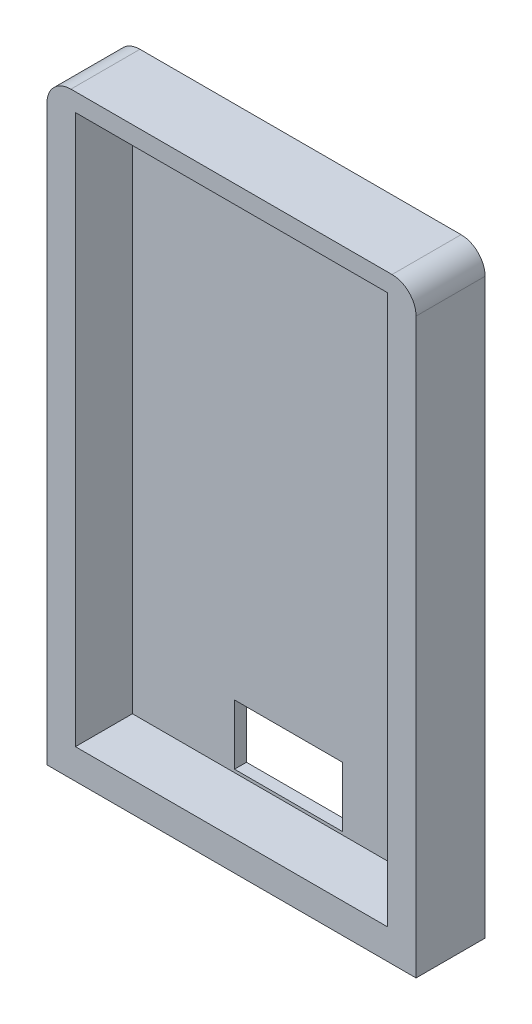
ISO-10303-21;
HEADER;
FILE_DESCRIPTION(('STEP AP214'),'2;1');
FILE_NAME('part.step','',(''),(''),'','','');
FILE_SCHEMA(('AUTOMOTIVE_DESIGN { 1 0 10303 214 1 1 1 1 }'));
ENDSEC;
DATA;
#1=APPLICATION_CONTEXT('core data for automotive mechanical design processes');
#2=APPLICATION_PROTOCOL_DEFINITION('international standard','automotive_design',2000,#1);
#3=PRODUCT_CONTEXT('',#1,'mechanical');
#4=PRODUCT('Part','Part','',(#3));
#5=PRODUCT_RELATED_PRODUCT_CATEGORY('part','',(#4));
#6=PRODUCT_DEFINITION_FORMATION('','',#4);
#7=PRODUCT_DEFINITION_CONTEXT('part definition',#1,'design');
#8=PRODUCT_DEFINITION('design','',#6,#7);
#9=PRODUCT_DEFINITION_SHAPE('','',#8);
#10=(LENGTH_UNIT() NAMED_UNIT(*) SI_UNIT(.MILLI.,.METRE.));
#11=(NAMED_UNIT(*) PLANE_ANGLE_UNIT() SI_UNIT($,.RADIAN.));
#12=(NAMED_UNIT(*) SI_UNIT($,.STERADIAN.) SOLID_ANGLE_UNIT());
#13=UNCERTAINTY_MEASURE_WITH_UNIT(LENGTH_MEASURE(1.E-05),#10,'distance_accuracy_value','');
#14=(GEOMETRIC_REPRESENTATION_CONTEXT(3) GLOBAL_UNCERTAINTY_ASSIGNED_CONTEXT((#13)) GLOBAL_UNIT_ASSIGNED_CONTEXT((#10,
#11,#12)) REPRESENTATION_CONTEXT('',''));
#15=CARTESIAN_POINT('',(0.,0.,0.));
#16=DIRECTION('',(0.,0.,1.));
#17=DIRECTION('',(1.,0.,0.));
#18=AXIS2_PLACEMENT_3D('',#15,#16,#17);
#19=CARTESIAN_POINT('',(1.20080642964174,9.30316060482236,15.8106));
#20=DIRECTION('',(0.,1.,0.));
#21=DIRECTION('',(-1.,0.,0.));
#22=AXIS2_PLACEMENT_3D('',#19,#20,#21);
#23=PLANE('',#22);
#24=DIRECTION('',(-1.,0.,0.));
#25=VECTOR('',#24,1.);
#26=CARTESIAN_POINT('',(0.,9.30316060482236,16.2106));
#27=LINE('',#26,#25);
#28=CARTESIAN_POINT('',(1.20080642964174,9.30316060482236,16.2106));
#29=VERTEX_POINT('',#28);
#30=CARTESIAN_POINT('',(-9.19919357035826,9.30316060482236,16.2106));
#31=VERTEX_POINT('',#30);
#32=EDGE_CURVE('E150',#29,#31,#27,.T.);
#33=ORIENTED_EDGE('',*,*,#32,.F.);
#34=DIRECTION('',(0.,0.,1.));
#35=VECTOR('',#34,1.);
#36=CARTESIAN_POINT('',(1.20080642964174,9.30316060482236,15.8106));
#37=LINE('',#36,#35);
#38=CARTESIAN_POINT('',(1.20080642964174,9.30316060482236,18.1106));
#39=VERTEX_POINT('',#38);
#40=EDGE_CURVE('E207',#29,#39,#37,.T.);
#41=ORIENTED_EDGE('',*,*,#40,.T.);
#42=DIRECTION('',(-1.,0.,0.));
#43=VECTOR('',#42,1.);
#44=CARTESIAN_POINT('',(1.20080642964174,9.30316060482236,18.1106));
#45=LINE('',#44,#43);
#46=CARTESIAN_POINT('',(-9.19919357035826,9.30316060482236,18.1106));
#47=VERTEX_POINT('',#46);
#48=EDGE_CURVE('E191',#39,#47,#45,.T.);
#49=ORIENTED_EDGE('',*,*,#48,.T.);
#50=DIRECTION('',(0.,0.,1.));
#51=VECTOR('',#50,1.);
#52=CARTESIAN_POINT('',(-9.19919357035826,9.30316060482236,15.8106));
#53=LINE('',#52,#51);
#54=EDGE_CURVE('E206',#31,#47,#53,.T.);
#55=ORIENTED_EDGE('',*,*,#54,.F.);
#56=EDGE_LOOP('',(#33,#41,#49,#55));
#57=FACE_BOUND('',#56,.T.);
#58=ADVANCED_FACE('F35',(#57),#23,.F.);
#59=CARTESIAN_POINT('',(1.20080642964174,-8.99683939517764,15.8106));
#60=DIRECTION('',(1.,0.,0.));
#61=DIRECTION('',(0.,0.,-1.));
#62=AXIS2_PLACEMENT_3D('',#59,#60,#61);
#63=PLANE('',#62);
#64=DIRECTION('',(0.,1.,0.));
#65=VECTOR('',#64,1.);
#66=CARTESIAN_POINT('',(1.20080642964174,0.,16.2106));
#67=LINE('',#66,#65);
#68=CARTESIAN_POINT('',(1.20080642964174,-8.99683939517764,16.2106));
#69=VERTEX_POINT('',#68);
#70=EDGE_CURVE('E171',#69,#29,#67,.T.);
#71=ORIENTED_EDGE('',*,*,#70,.F.);
#72=DIRECTION('',(0.,0.,1.));
#73=VECTOR('',#72,1.);
#74=CARTESIAN_POINT('',(1.20080642964174,-8.99683939517764,15.8106));
#75=LINE('',#74,#73);
#76=CARTESIAN_POINT('',(1.20080642964174,-8.99683939517764,18.1106));
#77=VERTEX_POINT('',#76);
#78=EDGE_CURVE('E210',#69,#77,#75,.T.);
#79=ORIENTED_EDGE('',*,*,#78,.T.);
#80=DIRECTION('',(0.,1.,0.));
#81=VECTOR('',#80,1.);
#82=CARTESIAN_POINT('',(1.20080642964174,-8.99683939517764,18.1106));
#83=LINE('',#82,#81);
#84=EDGE_CURVE('E203',#77,#39,#83,.T.);
#85=ORIENTED_EDGE('',*,*,#84,.T.);
#86=ORIENTED_EDGE('',*,*,#40,.F.);
#87=EDGE_LOOP('',(#71,#79,#85,#86));
#88=FACE_BOUND('',#87,.T.);
#89=ADVANCED_FACE('F278',(#88),#63,.F.);
#90=CARTESIAN_POINT('',(-9.19919357035826,-8.99683939517764,15.8106));
#91=DIRECTION('',(0.,-1.,0.));
#92=DIRECTION('',(0.,0.,-1.));
#93=AXIS2_PLACEMENT_3D('',#90,#91,#92);
#94=PLANE('',#93);
#95=DIRECTION('',(1.,0.,0.));
#96=VECTOR('',#95,1.);
#97=CARTESIAN_POINT('',(0.,-8.99683939517764,16.2106));
#98=LINE('',#97,#96);
#99=CARTESIAN_POINT('',(-9.19919357035826,-8.99683939517764,16.2106));
#100=VERTEX_POINT('',#99);
#101=EDGE_CURVE('E174',#100,#69,#98,.T.);
#102=ORIENTED_EDGE('',*,*,#101,.F.);
#103=DIRECTION('',(0.,0.,1.));
#104=VECTOR('',#103,1.);
#105=CARTESIAN_POINT('',(-9.19919357035826,-8.99683939517764,15.8106));
#106=LINE('',#105,#104);
#107=CARTESIAN_POINT('',(-9.19919357035826,-8.99683939517764,18.1106));
#108=VERTEX_POINT('',#107);
#109=EDGE_CURVE('E212',#100,#108,#106,.T.);
#110=ORIENTED_EDGE('',*,*,#109,.T.);
#111=DIRECTION('',(1.,0.,0.));
#112=VECTOR('',#111,1.);
#113=CARTESIAN_POINT('',(-9.19919357035826,-8.99683939517764,18.1106));
#114=LINE('',#113,#112);
#115=EDGE_CURVE('E200',#108,#77,#114,.T.);
#116=ORIENTED_EDGE('',*,*,#115,.T.);
#117=ORIENTED_EDGE('',*,*,#78,.F.);
#118=EDGE_LOOP('',(#102,#110,#116,#117));
#119=FACE_BOUND('',#118,.T.);
#120=ADVANCED_FACE('F284',(#119),#94,.F.);
#121=CARTESIAN_POINT('',(-9.19919357035826,9.30316060482236,15.8106));
#122=DIRECTION('',(-1.,0.,0.));
#123=DIRECTION('',(0.,-1.,0.));
#124=AXIS2_PLACEMENT_3D('',#121,#122,#123);
#125=PLANE('',#124);
#126=DIRECTION('',(0.,-1.,0.));
#127=VECTOR('',#126,1.);
#128=CARTESIAN_POINT('',(-9.19919357035826,0.,16.2106));
#129=LINE('',#128,#127);
#130=EDGE_CURVE('E177',#31,#100,#129,.T.);
#131=ORIENTED_EDGE('',*,*,#130,.F.);
#132=ORIENTED_EDGE('',*,*,#54,.T.);
#133=DIRECTION('',(0.,-1.,0.));
#134=VECTOR('',#133,1.);
#135=CARTESIAN_POINT('',(-9.19919357035826,9.30316060482236,18.1106));
#136=LINE('',#135,#134);
#137=EDGE_CURVE('E197',#47,#108,#136,.T.);
#138=ORIENTED_EDGE('',*,*,#137,.T.);
#139=ORIENTED_EDGE('',*,*,#109,.F.);
#140=EDGE_LOOP('',(#131,#132,#138,#139));
#141=FACE_BOUND('',#140,.T.);
#142=ADVANCED_FACE('F289',(#141),#125,.F.);
#143=CARTESIAN_POINT('',(2.15080642964174,9.90316060482236,15.8106));
#144=DIRECTION('',(1.,0.,0.));
#145=DIRECTION('',(0.,0.,-1.));
#146=AXIS2_PLACEMENT_3D('',#143,#144,#145);
#147=PLANE('',#146);
#148=DIRECTION('',(0.,1.,0.));
#149=VECTOR('',#148,1.);
#150=CARTESIAN_POINT('',(2.15080642964174,9.90316060482236,15.8106));
#151=LINE('',#150,#149);
#152=CARTESIAN_POINT('',(2.15080642964174,-9.99683939517764,15.8106));
#153=VERTEX_POINT('',#152);
#154=CARTESIAN_POINT('',(2.15080642964174,9.10316060482236,15.8106));
#155=VERTEX_POINT('',#154);
#156=EDGE_CURVE('E215',#153,#155,#151,.T.);
#157=ORIENTED_EDGE('',*,*,#156,.T.);
#158=DIRECTION('',(0.,0.,1.));
#159=VECTOR('',#158,1.);
#160=CARTESIAN_POINT('',(2.15080642964174,9.10316060482236,15.8106));
#161=LINE('',#160,#159);
#162=CARTESIAN_POINT('',(2.15080642964174,9.10316060482236,18.1106));
#163=VERTEX_POINT('',#162);
#164=EDGE_CURVE('E11',#155,#163,#161,.T.);
#165=ORIENTED_EDGE('',*,*,#164,.T.);
#166=DIRECTION('',(0.,1.,0.));
#167=VECTOR('',#166,1.);
#168=CARTESIAN_POINT('',(2.15080642964174,9.90316060482236,18.1106));
#169=LINE('',#168,#167);
#170=CARTESIAN_POINT('',(2.15080642964174,-9.99683939517764,18.1106));
#171=VERTEX_POINT('',#170);
#172=EDGE_CURVE('E209',#171,#163,#169,.T.);
#173=ORIENTED_EDGE('',*,*,#172,.F.);
#174=DIRECTION('',(0.,0.,1.));
#175=VECTOR('',#174,1.);
#176=CARTESIAN_POINT('',(2.15080642964174,-9.99683939517764,15.8106));
#177=LINE('',#176,#175);
#178=EDGE_CURVE('E236',#153,#171,#177,.T.);
#179=ORIENTED_EDGE('',*,*,#178,.F.);
#180=EDGE_LOOP('',(#157,#165,#173,#179));
#181=FACE_BOUND('',#180,.T.);
#182=ADVANCED_FACE('F270',(#181),#147,.T.);
#183=CARTESIAN_POINT('',(-10.1491935703583,-9.99683939517764,15.8106));
#184=DIRECTION('',(0.,-1.,0.));
#185=DIRECTION('',(0.,0.,-1.));
#186=AXIS2_PLACEMENT_3D('',#183,#184,#185);
#187=PLANE('',#186);
#188=DIRECTION('',(1.,0.,0.));
#189=VECTOR('',#188,1.);
#190=CARTESIAN_POINT('',(-10.1491935703583,-9.99683939517764,18.1106));
#191=LINE('',#190,#189);
#192=CARTESIAN_POINT('',(-10.1491935703583,-9.99683939517764,18.1106));
#193=VERTEX_POINT('',#192);
#194=EDGE_CURVE('E218',#193,#171,#191,.T.);
#195=ORIENTED_EDGE('',*,*,#194,.F.);
#196=DIRECTION('',(0.,0.,1.));
#197=VECTOR('',#196,1.);
#198=CARTESIAN_POINT('',(-10.1491935703583,-9.99683939517764,15.8106));
#199=LINE('',#198,#197);
#200=CARTESIAN_POINT('',(-10.1491935703583,-9.99683939517764,15.8106));
#201=VERTEX_POINT('',#200);
#202=EDGE_CURVE('E226',#201,#193,#199,.T.);
#203=ORIENTED_EDGE('',*,*,#202,.F.);
#204=DIRECTION('',(1.,0.,0.));
#205=VECTOR('',#204,1.);
#206=CARTESIAN_POINT('',(-10.1491935703583,-9.99683939517764,15.8106));
#207=LINE('',#206,#205);
#208=EDGE_CURVE('E223',#201,#153,#207,.T.);
#209=ORIENTED_EDGE('',*,*,#208,.T.);
#210=ORIENTED_EDGE('',*,*,#178,.T.);
#211=EDGE_LOOP('',(#195,#203,#209,#210));
#212=FACE_BOUND('',#211,.T.);
#213=ADVANCED_FACE('F267',(#212),#187,.T.);
#214=CARTESIAN_POINT('',(-10.1491935703583,-9.99683939517764,15.8106));
#215=DIRECTION('',(-1.,0.,0.));
#216=DIRECTION('',(0.,0.,1.));
#217=AXIS2_PLACEMENT_3D('',#214,#215,#216);
#218=PLANE('',#217);
#219=DIRECTION('',(0.,-1.,0.));
#220=VECTOR('',#219,1.);
#221=CARTESIAN_POINT('',(-10.1491935703583,-9.99683939517764,18.1106));
#222=LINE('',#221,#220);
#223=CARTESIAN_POINT('',(-10.1491935703583,9.10316060482236,18.1106));
#224=VERTEX_POINT('',#223);
#225=EDGE_CURVE('E232',#224,#193,#222,.T.);
#226=ORIENTED_EDGE('',*,*,#225,.F.);
#227=DIRECTION('',(0.,0.,1.));
#228=VECTOR('',#227,1.);
#229=CARTESIAN_POINT('',(-10.1491935703583,9.10316060482236,15.8106));
#230=LINE('',#229,#228);
#231=CARTESIAN_POINT('',(-10.1491935703583,9.10316060482236,15.8106));
#232=VERTEX_POINT('',#231);
#233=EDGE_CURVE('E58',#224,#232,#230,.F.);
#234=ORIENTED_EDGE('',*,*,#233,.T.);
#235=DIRECTION('',(0.,-1.,0.));
#236=VECTOR('',#235,1.);
#237=CARTESIAN_POINT('',(-10.1491935703583,-9.99683939517764,15.8106));
#238=LINE('',#237,#236);
#239=EDGE_CURVE('E221',#232,#201,#238,.T.);
#240=ORIENTED_EDGE('',*,*,#239,.T.);
#241=ORIENTED_EDGE('',*,*,#202,.T.);
#242=EDGE_LOOP('',(#226,#234,#240,#241));
#243=FACE_BOUND('',#242,.T.);
#244=ADVANCED_FACE('F263',(#243),#218,.T.);
#245=CARTESIAN_POINT('',(-10.1491935703583,9.90316060482236,15.8106));
#246=DIRECTION('',(0.,1.,0.));
#247=DIRECTION('',(0.,0.,1.));
#248=AXIS2_PLACEMENT_3D('',#245,#246,#247);
#249=PLANE('',#248);
#250=DIRECTION('',(-1.,0.,0.));
#251=VECTOR('',#250,1.);
#252=CARTESIAN_POINT('',(-10.1491935703583,9.90316060482236,15.8106));
#253=LINE('',#252,#251);
#254=CARTESIAN_POINT('',(1.35080642964174,9.90316060482236,15.8106));
#255=VERTEX_POINT('',#254);
#256=CARTESIAN_POINT('',(-9.34919357035826,9.90316060482236,15.8106));
#257=VERTEX_POINT('',#256);
#258=EDGE_CURVE('E217',#255,#257,#253,.T.);
#259=ORIENTED_EDGE('',*,*,#258,.T.);
#260=DIRECTION('',(0.,0.,1.));
#261=VECTOR('',#260,1.);
#262=CARTESIAN_POINT('',(-9.34919357035826,9.90316060482236,15.8106));
#263=LINE('',#262,#261);
#264=CARTESIAN_POINT('',(-9.34919357035826,9.90316060482236,18.1106));
#265=VERTEX_POINT('',#264);
#266=EDGE_CURVE('E242',#257,#265,#263,.T.);
#267=ORIENTED_EDGE('',*,*,#266,.T.);
#268=DIRECTION('',(-1.,0.,0.));
#269=VECTOR('',#268,1.);
#270=CARTESIAN_POINT('',(-10.1491935703583,9.90316060482236,18.1106));
#271=LINE('',#270,#269);
#272=CARTESIAN_POINT('',(1.35080642964174,9.90316060482236,18.1106));
#273=VERTEX_POINT('',#272);
#274=EDGE_CURVE('E229',#273,#265,#271,.T.);
#275=ORIENTED_EDGE('',*,*,#274,.F.);
#276=DIRECTION('',(0.,0.,1.));
#277=VECTOR('',#276,1.);
#278=CARTESIAN_POINT('',(1.35080642964174,9.90316060482236,15.8106));
#279=LINE('',#278,#277);
#280=EDGE_CURVE('E238',#273,#255,#279,.F.);
#281=ORIENTED_EDGE('',*,*,#280,.T.);
#282=EDGE_LOOP('',(#259,#267,#275,#281));
#283=FACE_BOUND('',#282,.T.);
#284=ADVANCED_FACE('F257',(#283),#249,.T.);
#285=CARTESIAN_POINT('',(0.,0.,15.8106));
#286=DIRECTION('',(0.,0.,1.));
#287=DIRECTION('',(1.,0.,0.));
#288=AXIS2_PLACEMENT_3D('',#285,#286,#287);
#289=PLANE('',#288);
#290=ORIENTED_EDGE('',*,*,#239,.F.);
#291=CARTESIAN_POINT('',(-9.34919357035826,9.10316060482236,15.8106));
#292=DIRECTION('',(0.,0.,1.));
#293=DIRECTION('',(1.,0.,0.));
#294=AXIS2_PLACEMENT_3D('',#291,#292,#293);
#295=CIRCLE('',#294,0.8);
#296=EDGE_CURVE('E43',#232,#257,#295,.F.);
#297=ORIENTED_EDGE('',*,*,#296,.T.);
#298=ORIENTED_EDGE('',*,*,#258,.F.);
#299=CARTESIAN_POINT('',(1.35080642964174,9.10316060482236,15.8106));
#300=DIRECTION('',(0.,0.,1.));
#301=DIRECTION('',(1.,0.,0.));
#302=AXIS2_PLACEMENT_3D('',#299,#300,#301);
#303=CIRCLE('',#302,0.8);
#304=EDGE_CURVE('E50',#255,#155,#303,.F.);
#305=ORIENTED_EDGE('',*,*,#304,.T.);
#306=ORIENTED_EDGE('',*,*,#156,.F.);
#307=ORIENTED_EDGE('',*,*,#208,.F.);
#308=EDGE_LOOP('',(#290,#297,#298,#305,#306,#307));
#309=FACE_BOUND('',#308,.T.);
#310=DIRECTION('',(0.,-1.,0.));
#311=VECTOR('',#310,1.);
#312=CARTESIAN_POINT('',(-2.19919357035826,0.,15.8106));
#313=LINE('',#312,#311);
#314=CARTESIAN_POINT('',(-2.19919357035826,-6.89683939517764,15.8106));
#315=VERTEX_POINT('',#314);
#316=CARTESIAN_POINT('',(-2.19919357035826,-8.89683939517764,15.8106));
#317=VERTEX_POINT('',#316);
#318=EDGE_CURVE('E182',#315,#317,#313,.T.);
#319=ORIENTED_EDGE('',*,*,#318,.F.);
#320=DIRECTION('',(-1.,0.,0.));
#321=VECTOR('',#320,1.);
#322=CARTESIAN_POINT('',(0.,-6.89683939517764,15.8106));
#323=LINE('',#322,#321);
#324=CARTESIAN_POINT('',(-5.79919357035826,-6.89683939517764,15.8106));
#325=VERTEX_POINT('',#324);
#326=EDGE_CURVE('E145',#315,#325,#323,.T.);
#327=ORIENTED_EDGE('',*,*,#326,.T.);
#328=DIRECTION('',(0.,-1.,0.));
#329=VECTOR('',#328,1.);
#330=CARTESIAN_POINT('',(-5.79919357035826,0.,15.8106));
#331=LINE('',#330,#329);
#332=CARTESIAN_POINT('',(-5.79919357035826,-8.89683939517764,15.8106));
#333=VERTEX_POINT('',#332);
#334=EDGE_CURVE('E185',#325,#333,#331,.T.);
#335=ORIENTED_EDGE('',*,*,#334,.T.);
#336=DIRECTION('',(-1.,0.,0.));
#337=VECTOR('',#336,1.);
#338=CARTESIAN_POINT('',(0.,-8.89683939517764,15.8106));
#339=LINE('',#338,#337);
#340=EDGE_CURVE('E159',#317,#333,#339,.T.);
#341=ORIENTED_EDGE('',*,*,#340,.F.);
#342=EDGE_LOOP('',(#319,#327,#335,#341));
#343=FACE_BOUND('',#342,.T.);
#344=ADVANCED_FACE('F251',(#309,#343),#289,.F.);
#345=CARTESIAN_POINT('',(0.,0.,18.1106));
#346=DIRECTION('',(0.,0.,1.));
#347=DIRECTION('',(1.,0.,0.));
#348=AXIS2_PLACEMENT_3D('',#345,#346,#347);
#349=PLANE('',#348);
#350=ORIENTED_EDGE('',*,*,#48,.F.);
#351=ORIENTED_EDGE('',*,*,#84,.F.);
#352=ORIENTED_EDGE('',*,*,#115,.F.);
#353=ORIENTED_EDGE('',*,*,#137,.F.);
#354=EDGE_LOOP('',(#350,#351,#352,#353));
#355=FACE_BOUND('',#354,.T.);
#356=ORIENTED_EDGE('',*,*,#274,.T.);
#357=CARTESIAN_POINT('',(-9.34919357035826,9.10316060482236,18.1106));
#358=DIRECTION('',(0.,0.,1.));
#359=DIRECTION('',(1.,0.,0.));
#360=AXIS2_PLACEMENT_3D('',#357,#358,#359);
#361=CIRCLE('',#360,0.8);
#362=EDGE_CURVE('E247',#265,#224,#361,.T.);
#363=ORIENTED_EDGE('',*,*,#362,.T.);
#364=ORIENTED_EDGE('',*,*,#225,.T.);
#365=ORIENTED_EDGE('',*,*,#194,.T.);
#366=ORIENTED_EDGE('',*,*,#172,.T.);
#367=CARTESIAN_POINT('',(1.35080642964174,9.10316060482236,18.1106));
#368=DIRECTION('',(0.,0.,1.));
#369=DIRECTION('',(1.,0.,0.));
#370=AXIS2_PLACEMENT_3D('',#367,#368,#369);
#371=CIRCLE('',#370,0.8);
#372=EDGE_CURVE('E245',#163,#273,#371,.T.);
#373=ORIENTED_EDGE('',*,*,#372,.T.);
#374=EDGE_LOOP('',(#356,#363,#364,#365,#366,#373));
#375=FACE_BOUND('',#374,.T.);
#376=ADVANCED_FACE('F262',(#355,#375),#349,.T.);
#377=CARTESIAN_POINT('',(-2.19919357035826,0.,16.2106));
#378=DIRECTION('',(1.,0.,0.));
#379=DIRECTION('',(0.,0.,-1.));
#380=AXIS2_PLACEMENT_3D('',#377,#378,#379);
#381=PLANE('',#380);
#382=ORIENTED_EDGE('',*,*,#318,.T.);
#383=DIRECTION('',(0.,0.,-1.));
#384=VECTOR('',#383,1.);
#385=CARTESIAN_POINT('',(-2.19919357035826,-8.89683939517764,16.2106));
#386=LINE('',#385,#384);
#387=CARTESIAN_POINT('',(-2.19919357035826,-8.89683939517764,16.2106));
#388=VERTEX_POINT('',#387);
#389=EDGE_CURVE('E157',#388,#317,#386,.T.);
#390=ORIENTED_EDGE('',*,*,#389,.F.);
#391=DIRECTION('',(0.,-1.,0.));
#392=VECTOR('',#391,1.);
#393=CARTESIAN_POINT('',(-2.19919357035826,0.,16.2106));
#394=LINE('',#393,#392);
#395=CARTESIAN_POINT('',(-2.19919357035826,-6.89683939517764,16.2106));
#396=VERTEX_POINT('',#395);
#397=EDGE_CURVE('E154',#396,#388,#394,.T.);
#398=ORIENTED_EDGE('',*,*,#397,.F.);
#399=DIRECTION('',(0.,0.,-1.));
#400=VECTOR('',#399,1.);
#401=CARTESIAN_POINT('',(-2.19919357035826,-6.89683939517764,16.2106));
#402=LINE('',#401,#400);
#403=EDGE_CURVE('E139',#396,#315,#402,.T.);
#404=ORIENTED_EDGE('',*,*,#403,.T.);
#405=EDGE_LOOP('',(#382,#390,#398,#404));
#406=FACE_BOUND('',#405,.T.);
#407=ADVANCED_FACE('F155',(#406),#381,.F.);
#408=CARTESIAN_POINT('',(0.,-8.89683939517764,16.2106));
#409=DIRECTION('',(0.,-1.,0.));
#410=DIRECTION('',(0.,0.,-1.));
#411=AXIS2_PLACEMENT_3D('',#408,#409,#410);
#412=PLANE('',#411);
#413=ORIENTED_EDGE('',*,*,#340,.T.);
#414=DIRECTION('',(0.,0.,-1.));
#415=VECTOR('',#414,1.);
#416=CARTESIAN_POINT('',(-5.79919357035826,-8.89683939517764,16.2106));
#417=LINE('',#416,#415);
#418=CARTESIAN_POINT('',(-5.79919357035826,-8.89683939517764,16.2106));
#419=VERTEX_POINT('',#418);
#420=EDGE_CURVE('E192',#419,#333,#417,.T.);
#421=ORIENTED_EDGE('',*,*,#420,.F.);
#422=DIRECTION('',(-1.,0.,0.));
#423=VECTOR('',#422,1.);
#424=CARTESIAN_POINT('',(0.,-8.89683939517764,16.2106));
#425=LINE('',#424,#423);
#426=EDGE_CURVE('E167',#388,#419,#425,.T.);
#427=ORIENTED_EDGE('',*,*,#426,.F.);
#428=ORIENTED_EDGE('',*,*,#389,.T.);
#429=EDGE_LOOP('',(#413,#421,#427,#428));
#430=FACE_BOUND('',#429,.T.);
#431=ADVANCED_FACE('F327',(#430),#412,.F.);
#432=CARTESIAN_POINT('',(-5.79919357035826,0.,16.2106));
#433=DIRECTION('',(1.,0.,0.));
#434=DIRECTION('',(0.,0.,-1.));
#435=AXIS2_PLACEMENT_3D('',#432,#433,#434);
#436=PLANE('',#435);
#437=ORIENTED_EDGE('',*,*,#334,.F.);
#438=DIRECTION('',(0.,0.,-1.));
#439=VECTOR('',#438,1.);
#440=CARTESIAN_POINT('',(-5.79919357035826,-6.89683939517764,16.2106));
#441=LINE('',#440,#439);
#442=CARTESIAN_POINT('',(-5.79919357035826,-6.89683939517764,16.2106));
#443=VERTEX_POINT('',#442);
#444=EDGE_CURVE('E149',#443,#325,#441,.T.);
#445=ORIENTED_EDGE('',*,*,#444,.F.);
#446=DIRECTION('',(0.,-1.,0.));
#447=VECTOR('',#446,1.);
#448=CARTESIAN_POINT('',(-5.79919357035826,0.,16.2106));
#449=LINE('',#448,#447);
#450=EDGE_CURVE('E165',#443,#419,#449,.T.);
#451=ORIENTED_EDGE('',*,*,#450,.T.);
#452=ORIENTED_EDGE('',*,*,#420,.T.);
#453=EDGE_LOOP('',(#437,#445,#451,#452));
#454=FACE_BOUND('',#453,.T.);
#455=ADVANCED_FACE('F324',(#454),#436,.T.);
#456=CARTESIAN_POINT('',(0.,-6.89683939517764,16.2106));
#457=DIRECTION('',(0.,-1.,0.));
#458=DIRECTION('',(0.,0.,-1.));
#459=AXIS2_PLACEMENT_3D('',#456,#457,#458);
#460=PLANE('',#459);
#461=ORIENTED_EDGE('',*,*,#326,.F.);
#462=ORIENTED_EDGE('',*,*,#403,.F.);
#463=DIRECTION('',(-1.,0.,0.));
#464=VECTOR('',#463,1.);
#465=CARTESIAN_POINT('',(0.,-6.89683939517764,16.2106));
#466=LINE('',#465,#464);
#467=EDGE_CURVE('E143',#396,#443,#466,.T.);
#468=ORIENTED_EDGE('',*,*,#467,.T.);
#469=ORIENTED_EDGE('',*,*,#444,.T.);
#470=EDGE_LOOP('',(#461,#462,#468,#469));
#471=FACE_BOUND('',#470,.T.);
#472=ADVANCED_FACE('F141',(#471),#460,.T.);
#473=CARTESIAN_POINT('',(0.,0.,16.2106));
#474=DIRECTION('',(0.,0.,-1.));
#475=DIRECTION('',(-1.,0.,0.));
#476=AXIS2_PLACEMENT_3D('',#473,#474,#475);
#477=PLANE('',#476);
#478=ORIENTED_EDGE('',*,*,#397,.T.);
#479=ORIENTED_EDGE('',*,*,#426,.T.);
#480=ORIENTED_EDGE('',*,*,#450,.F.);
#481=ORIENTED_EDGE('',*,*,#467,.F.);
#482=EDGE_LOOP('',(#478,#479,#480,#481));
#483=FACE_BOUND('',#482,.T.);
#484=ORIENTED_EDGE('',*,*,#70,.T.);
#485=ORIENTED_EDGE('',*,*,#32,.T.);
#486=ORIENTED_EDGE('',*,*,#130,.T.);
#487=ORIENTED_EDGE('',*,*,#101,.T.);
#488=EDGE_LOOP('',(#484,#485,#486,#487));
#489=FACE_BOUND('',#488,.T.);
#490=ADVANCED_FACE('F162',(#483,#489),#477,.F.);
#491=CARTESIAN_POINT('',(-9.34919357035826,9.10316060482236,15.8106));
#492=DIRECTION('',(0.,0.,1.));
#493=DIRECTION('',(1.,0.,0.));
#494=AXIS2_PLACEMENT_3D('',#491,#492,#493);
#495=CYLINDRICAL_SURFACE('',#494,0.8);
#496=ORIENTED_EDGE('',*,*,#296,.F.);
#497=ORIENTED_EDGE('',*,*,#233,.F.);
#498=ORIENTED_EDGE('',*,*,#362,.F.);
#499=ORIENTED_EDGE('',*,*,#266,.F.);
#500=EDGE_LOOP('',(#496,#497,#498,#499));
#501=FACE_BOUND('',#500,.T.);
#502=ADVANCED_FACE('F260',(#501),#495,.T.);
#503=CARTESIAN_POINT('',(1.35080642964174,9.10316060482236,15.8106));
#504=DIRECTION('',(0.,0.,1.));
#505=DIRECTION('',(1.,0.,0.));
#506=AXIS2_PLACEMENT_3D('',#503,#504,#505);
#507=CYLINDRICAL_SURFACE('',#506,0.8);
#508=ORIENTED_EDGE('',*,*,#304,.F.);
#509=ORIENTED_EDGE('',*,*,#280,.F.);
#510=ORIENTED_EDGE('',*,*,#372,.F.);
#511=ORIENTED_EDGE('',*,*,#164,.F.);
#512=EDGE_LOOP('',(#508,#509,#510,#511));
#513=FACE_BOUND('',#512,.T.);
#514=ADVANCED_FACE('F37',(#513),#507,.T.);
#515=CLOSED_SHELL('',(#58,#89,#120,#142,#182,#213,#244,#284,#344,#376,#407,#431,#455,#472,#490,
#502,#514));
#516=MANIFOLD_SOLID_BREP('B2',#515);
#517=ADVANCED_BREP_SHAPE_REPRESENTATION('',(#18,#516),#14);
#518=SHAPE_DEFINITION_REPRESENTATION(#9,#517);
ENDSEC;
END-ISO-10303-21;
